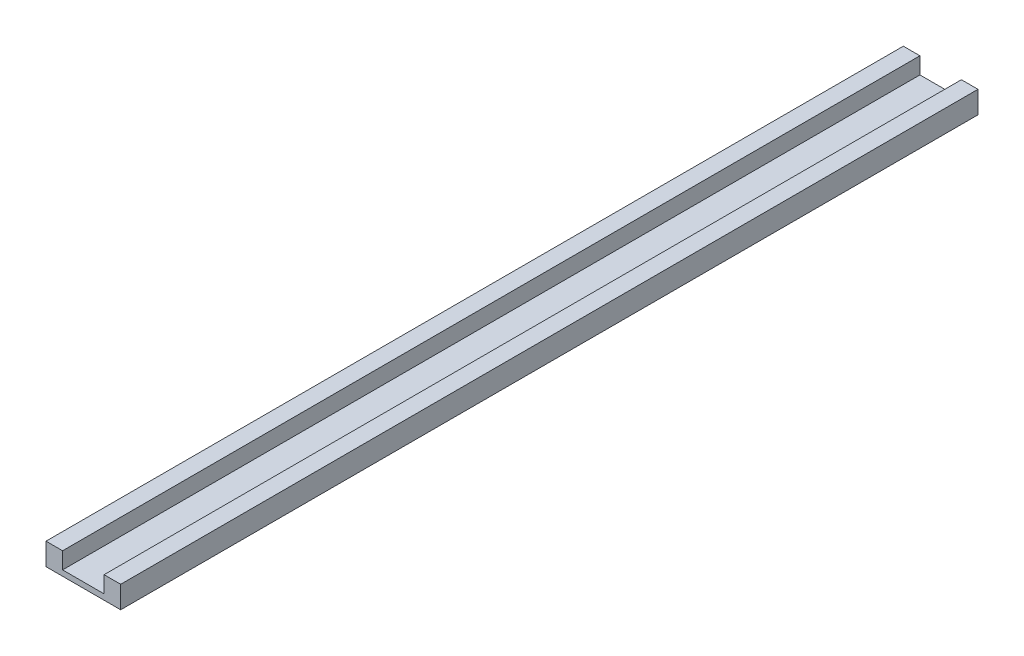
ISO-10303-21;
HEADER;
FILE_DESCRIPTION(('STEP AP214'),'2;1');
FILE_NAME('part.step','',(''),(''),'','','');
FILE_SCHEMA(('AUTOMOTIVE_DESIGN { 1 0 10303 214 1 1 1 1 }'));
ENDSEC;
DATA;
#1=APPLICATION_CONTEXT('core data for automotive mechanical design processes');
#2=APPLICATION_PROTOCOL_DEFINITION('international standard','automotive_design',2000,#1);
#3=PRODUCT_CONTEXT('',#1,'mechanical');
#4=PRODUCT('Part','Part','',(#3));
#5=PRODUCT_RELATED_PRODUCT_CATEGORY('part','',(#4));
#6=PRODUCT_DEFINITION_FORMATION('','',#4);
#7=PRODUCT_DEFINITION_CONTEXT('part definition',#1,'design');
#8=PRODUCT_DEFINITION('design','',#6,#7);
#9=PRODUCT_DEFINITION_SHAPE('','',#8);
#10=(LENGTH_UNIT() NAMED_UNIT(*) SI_UNIT(.MILLI.,.METRE.));
#11=(NAMED_UNIT(*) PLANE_ANGLE_UNIT() SI_UNIT($,.RADIAN.));
#12=(NAMED_UNIT(*) SI_UNIT($,.STERADIAN.) SOLID_ANGLE_UNIT());
#13=UNCERTAINTY_MEASURE_WITH_UNIT(LENGTH_MEASURE(1.E-05),#10,'distance_accuracy_value','');
#14=(GEOMETRIC_REPRESENTATION_CONTEXT(3) GLOBAL_UNCERTAINTY_ASSIGNED_CONTEXT((#13)) GLOBAL_UNIT_ASSIGNED_CONTEXT((#10,
#11,#12)) REPRESENTATION_CONTEXT('',''));
#15=CARTESIAN_POINT('',(0.,0.,0.));
#16=DIRECTION('',(0.,0.,1.));
#17=DIRECTION('',(1.,0.,0.));
#18=AXIS2_PLACEMENT_3D('',#15,#16,#17);
#19=CARTESIAN_POINT('',(0.,4.,350.));
#20=DIRECTION('',(0.,1.,0.));
#21=DIRECTION('',(0.,0.,1.));
#22=AXIS2_PLACEMENT_3D('',#19,#20,#21);
#23=PLANE('',#22);
#24=DIRECTION('',(0.,0.,-1.));
#25=VECTOR('',#24,1.);
#26=CARTESIAN_POINT('',(13.5,4.,350.));
#27=LINE('',#26,#25);
#28=CARTESIAN_POINT('',(13.5,4.,350.));
#29=VERTEX_POINT('',#28);
#30=CARTESIAN_POINT('',(13.5,4.,40.));
#31=VERTEX_POINT('',#30);
#32=EDGE_CURVE('E57',#29,#31,#27,.T.);
#33=ORIENTED_EDGE('',*,*,#32,.T.);
#34=DIRECTION('',(1.,0.,0.));
#35=VECTOR('',#34,1.);
#36=CARTESIAN_POINT('',(7.5,4.,40.));
#37=LINE('',#36,#35);
#38=CARTESIAN_POINT('',(7.5,4.,40.));
#39=VERTEX_POINT('',#38);
#40=EDGE_CURVE('E50',#39,#31,#37,.T.);
#41=ORIENTED_EDGE('',*,*,#40,.F.);
#42=DIRECTION('',(0.,0.,-1.));
#43=VECTOR('',#42,1.);
#44=CARTESIAN_POINT('',(7.5,4.,350.));
#45=LINE('',#44,#43);
#46=CARTESIAN_POINT('',(7.5,4.,350.));
#47=VERTEX_POINT('',#46);
#48=EDGE_CURVE('E11',#47,#39,#45,.T.);
#49=ORIENTED_EDGE('',*,*,#48,.F.);
#50=DIRECTION('',(1.,0.,0.));
#51=VECTOR('',#50,1.);
#52=CARTESIAN_POINT('',(0.,4.,350.));
#53=LINE('',#52,#51);
#54=EDGE_CURVE('E117',#47,#29,#53,.T.);
#55=ORIENTED_EDGE('',*,*,#54,.T.);
#56=EDGE_LOOP('',(#33,#41,#49,#55));
#57=FACE_BOUND('',#56,.T.);
#58=ADVANCED_FACE('F35',(#57),#23,.T.);
#59=CARTESIAN_POINT('',(7.5,0.,350.));
#60=DIRECTION('',(1.,0.,0.));
#61=DIRECTION('',(0.,0.,-1.));
#62=AXIS2_PLACEMENT_3D('',#59,#60,#61);
#63=PLANE('',#62);
#64=DIRECTION('',(0.,1.,0.));
#65=VECTOR('',#64,1.);
#66=CARTESIAN_POINT('',(7.5,-2.,40.));
#67=LINE('',#66,#65);
#68=CARTESIAN_POINT('',(7.5,-2.,40.));
#69=VERTEX_POINT('',#68);
#70=EDGE_CURVE('E99',#69,#39,#67,.T.);
#71=ORIENTED_EDGE('',*,*,#70,.F.);
#72=DIRECTION('',(0.,0.,-1.));
#73=VECTOR('',#72,1.);
#74=CARTESIAN_POINT('',(7.5,-2.,350.));
#75=LINE('',#74,#73);
#76=CARTESIAN_POINT('',(7.5,-2.,350.));
#77=VERTEX_POINT('',#76);
#78=EDGE_CURVE('E43',#77,#69,#75,.T.);
#79=ORIENTED_EDGE('',*,*,#78,.F.);
#80=DIRECTION('',(0.,-1.,0.));
#81=VECTOR('',#80,1.);
#82=CARTESIAN_POINT('',(7.5,0.,350.));
#83=LINE('',#82,#81);
#84=EDGE_CURVE('E111',#47,#77,#83,.T.);
#85=ORIENTED_EDGE('',*,*,#84,.F.);
#86=ORIENTED_EDGE('',*,*,#48,.T.);
#87=EDGE_LOOP('',(#71,#79,#85,#86));
#88=FACE_BOUND('',#87,.T.);
#89=ADVANCED_FACE('F37',(#88),#63,.F.);
#90=CARTESIAN_POINT('',(0.,-2.,350.));
#91=DIRECTION('',(0.,1.,0.));
#92=DIRECTION('',(0.,0.,1.));
#93=AXIS2_PLACEMENT_3D('',#90,#91,#92);
#94=PLANE('',#93);
#95=ORIENTED_EDGE('',*,*,#78,.T.);
#96=DIRECTION('',(1.,0.,0.));
#97=VECTOR('',#96,1.);
#98=CARTESIAN_POINT('',(-7.5,-2.,40.));
#99=LINE('',#98,#97);
#100=CARTESIAN_POINT('',(-7.5,-2.,40.));
#101=VERTEX_POINT('',#100);
#102=EDGE_CURVE('E102',#101,#69,#99,.T.);
#103=ORIENTED_EDGE('',*,*,#102,.F.);
#104=DIRECTION('',(0.,0.,-1.));
#105=VECTOR('',#104,1.);
#106=CARTESIAN_POINT('',(-7.5,-2.,350.));
#107=LINE('',#106,#105);
#108=CARTESIAN_POINT('',(-7.5,-2.,350.));
#109=VERTEX_POINT('',#108);
#110=EDGE_CURVE('E155',#109,#101,#107,.T.);
#111=ORIENTED_EDGE('',*,*,#110,.F.);
#112=DIRECTION('',(1.,0.,0.));
#113=VECTOR('',#112,1.);
#114=CARTESIAN_POINT('',(0.,-2.,350.));
#115=LINE('',#114,#113);
#116=EDGE_CURVE('E116',#109,#77,#115,.T.);
#117=ORIENTED_EDGE('',*,*,#116,.T.);
#118=EDGE_LOOP('',(#95,#103,#111,#117));
#119=FACE_BOUND('',#118,.T.);
#120=ADVANCED_FACE('F157',(#119),#94,.T.);
#121=CARTESIAN_POINT('',(-7.5,0.,350.));
#122=DIRECTION('',(1.,0.,0.));
#123=DIRECTION('',(0.,1.,0.));
#124=AXIS2_PLACEMENT_3D('',#121,#122,#123);
#125=PLANE('',#124);
#126=ORIENTED_EDGE('',*,*,#110,.T.);
#127=DIRECTION('',(0.,-1.,0.));
#128=VECTOR('',#127,1.);
#129=CARTESIAN_POINT('',(-7.5,4.,40.));
#130=LINE('',#129,#128);
#131=CARTESIAN_POINT('',(-7.5,4.,40.));
#132=VERTEX_POINT('',#131);
#133=EDGE_CURVE('E124',#132,#101,#130,.T.);
#134=ORIENTED_EDGE('',*,*,#133,.F.);
#135=DIRECTION('',(0.,0.,-1.));
#136=VECTOR('',#135,1.);
#137=CARTESIAN_POINT('',(-7.5,4.,350.));
#138=LINE('',#137,#136);
#139=CARTESIAN_POINT('',(-7.5,4.,350.));
#140=VERTEX_POINT('',#139);
#141=EDGE_CURVE('E153',#140,#132,#138,.T.);
#142=ORIENTED_EDGE('',*,*,#141,.F.);
#143=DIRECTION('',(0.,-1.,0.));
#144=VECTOR('',#143,1.);
#145=CARTESIAN_POINT('',(-7.5,0.,350.));
#146=LINE('',#145,#144);
#147=EDGE_CURVE('E128',#140,#109,#146,.T.);
#148=ORIENTED_EDGE('',*,*,#147,.T.);
#149=EDGE_LOOP('',(#126,#134,#142,#148));
#150=FACE_BOUND('',#149,.T.);
#151=ADVANCED_FACE('F190',(#150),#125,.T.);
#152=ORIENTED_EDGE('',*,*,#141,.T.);
#153=DIRECTION('',(1.,0.,0.));
#154=VECTOR('',#153,1.);
#155=CARTESIAN_POINT('',(-13.5,4.,40.));
#156=LINE('',#155,#154);
#157=CARTESIAN_POINT('',(-13.5,4.,40.));
#158=VERTEX_POINT('',#157);
#159=EDGE_CURVE('E196',#158,#132,#156,.T.);
#160=ORIENTED_EDGE('',*,*,#159,.F.);
#161=DIRECTION('',(0.,0.,-1.));
#162=VECTOR('',#161,1.);
#163=CARTESIAN_POINT('',(-13.5,4.,350.));
#164=LINE('',#163,#162);
#165=CARTESIAN_POINT('',(-13.5,4.,350.));
#166=VERTEX_POINT('',#165);
#167=EDGE_CURVE('E150',#166,#158,#164,.T.);
#168=ORIENTED_EDGE('',*,*,#167,.F.);
#169=EDGE_CURVE('E123',#166,#140,#53,.T.);
#170=ORIENTED_EDGE('',*,*,#169,.T.);
#171=EDGE_LOOP('',(#152,#160,#168,#170));
#172=FACE_BOUND('',#171,.T.);
#173=ADVANCED_FACE('F182',(#172),#23,.T.);
#174=CARTESIAN_POINT('',(-13.5,0.,350.));
#175=DIRECTION('',(1.,0.,0.));
#176=DIRECTION('',(0.,1.,0.));
#177=AXIS2_PLACEMENT_3D('',#174,#175,#176);
#178=PLANE('',#177);
#179=DIRECTION('',(0.,1.,0.));
#180=VECTOR('',#179,1.);
#181=CARTESIAN_POINT('',(-13.5,-4.,40.));
#182=LINE('',#181,#180);
#183=CARTESIAN_POINT('',(-13.5,-4.,40.));
#184=VERTEX_POINT('',#183);
#185=EDGE_CURVE('E165',#184,#158,#182,.T.);
#186=ORIENTED_EDGE('',*,*,#185,.F.);
#187=DIRECTION('',(0.,0.,-1.));
#188=VECTOR('',#187,1.);
#189=CARTESIAN_POINT('',(-13.5,-4.,350.));
#190=LINE('',#189,#188);
#191=CARTESIAN_POINT('',(-13.5,-4.,350.));
#192=VERTEX_POINT('',#191);
#193=EDGE_CURVE('E147',#192,#184,#190,.T.);
#194=ORIENTED_EDGE('',*,*,#193,.F.);
#195=DIRECTION('',(0.,-1.,0.));
#196=VECTOR('',#195,1.);
#197=CARTESIAN_POINT('',(-13.5,0.,350.));
#198=LINE('',#197,#196);
#199=EDGE_CURVE('E127',#166,#192,#198,.T.);
#200=ORIENTED_EDGE('',*,*,#199,.F.);
#201=ORIENTED_EDGE('',*,*,#167,.T.);
#202=EDGE_LOOP('',(#186,#194,#200,#201));
#203=FACE_BOUND('',#202,.T.);
#204=ADVANCED_FACE('F164',(#203),#178,.F.);
#205=CARTESIAN_POINT('',(0.,-4.,350.));
#206=DIRECTION('',(0.,1.,0.));
#207=DIRECTION('',(0.,0.,1.));
#208=AXIS2_PLACEMENT_3D('',#205,#206,#207);
#209=PLANE('',#208);
#210=DIRECTION('',(-1.,0.,0.));
#211=VECTOR('',#210,1.);
#212=CARTESIAN_POINT('',(13.5,-4.,40.));
#213=LINE('',#212,#211);
#214=CARTESIAN_POINT('',(13.5,-4.,40.));
#215=VERTEX_POINT('',#214);
#216=EDGE_CURVE('E169',#215,#184,#213,.T.);
#217=ORIENTED_EDGE('',*,*,#216,.F.);
#218=DIRECTION('',(0.,0.,-1.));
#219=VECTOR('',#218,1.);
#220=CARTESIAN_POINT('',(13.5,-4.,350.));
#221=LINE('',#220,#219);
#222=CARTESIAN_POINT('',(13.5,-4.,350.));
#223=VERTEX_POINT('',#222);
#224=EDGE_CURVE('E144',#223,#215,#221,.T.);
#225=ORIENTED_EDGE('',*,*,#224,.F.);
#226=DIRECTION('',(1.,0.,0.));
#227=VECTOR('',#226,1.);
#228=CARTESIAN_POINT('',(0.,-4.,350.));
#229=LINE('',#228,#227);
#230=EDGE_CURVE('E132',#192,#223,#229,.T.);
#231=ORIENTED_EDGE('',*,*,#230,.F.);
#232=ORIENTED_EDGE('',*,*,#193,.T.);
#233=EDGE_LOOP('',(#217,#225,#231,#232));
#234=FACE_BOUND('',#233,.T.);
#235=ADVANCED_FACE('F168',(#234),#209,.F.);
#236=CARTESIAN_POINT('',(13.5,0.,350.));
#237=DIRECTION('',(1.,0.,0.));
#238=DIRECTION('',(0.,1.,0.));
#239=AXIS2_PLACEMENT_3D('',#236,#237,#238);
#240=PLANE('',#239);
#241=ORIENTED_EDGE('',*,*,#224,.T.);
#242=DIRECTION('',(0.,-1.,0.));
#243=VECTOR('',#242,1.);
#244=CARTESIAN_POINT('',(13.5,4.,40.));
#245=LINE('',#244,#243);
#246=EDGE_CURVE('E109',#31,#215,#245,.T.);
#247=ORIENTED_EDGE('',*,*,#246,.F.);
#248=ORIENTED_EDGE('',*,*,#32,.F.);
#249=DIRECTION('',(0.,-1.,0.));
#250=VECTOR('',#249,1.);
#251=CARTESIAN_POINT('',(13.5,0.,350.));
#252=LINE('',#251,#250);
#253=EDGE_CURVE('E121',#29,#223,#252,.T.);
#254=ORIENTED_EDGE('',*,*,#253,.T.);
#255=EDGE_LOOP('',(#241,#247,#248,#254));
#256=FACE_BOUND('',#255,.T.);
#257=ADVANCED_FACE('F170',(#256),#240,.T.);
#258=CARTESIAN_POINT('',(0.,0.,350.));
#259=DIRECTION('',(0.,0.,1.));
#260=DIRECTION('',(1.,0.,0.));
#261=AXIS2_PLACEMENT_3D('',#258,#259,#260);
#262=PLANE('',#261);
#263=ORIENTED_EDGE('',*,*,#54,.F.);
#264=ORIENTED_EDGE('',*,*,#84,.T.);
#265=ORIENTED_EDGE('',*,*,#116,.F.);
#266=ORIENTED_EDGE('',*,*,#147,.F.);
#267=ORIENTED_EDGE('',*,*,#169,.F.);
#268=ORIENTED_EDGE('',*,*,#199,.T.);
#269=ORIENTED_EDGE('',*,*,#230,.T.);
#270=ORIENTED_EDGE('',*,*,#253,.F.);
#271=EDGE_LOOP('',(#263,#264,#265,#266,#267,#268,#269,#270));
#272=FACE_BOUND('',#271,.T.);
#273=ADVANCED_FACE('F120',(#272),#262,.T.);
#274=CARTESIAN_POINT('',(0.,0.,40.));
#275=DIRECTION('',(0.,0.,-1.));
#276=DIRECTION('',(-1.,0.,0.));
#277=AXIS2_PLACEMENT_3D('',#274,#275,#276);
#278=PLANE('',#277);
#279=ORIENTED_EDGE('',*,*,#70,.T.);
#280=ORIENTED_EDGE('',*,*,#40,.T.);
#281=ORIENTED_EDGE('',*,*,#246,.T.);
#282=ORIENTED_EDGE('',*,*,#216,.T.);
#283=ORIENTED_EDGE('',*,*,#185,.T.);
#284=ORIENTED_EDGE('',*,*,#159,.T.);
#285=ORIENTED_EDGE('',*,*,#133,.T.);
#286=ORIENTED_EDGE('',*,*,#102,.T.);
#287=EDGE_LOOP('',(#279,#280,#281,#282,#283,#284,#285,#286));
#288=FACE_BOUND('',#287,.T.);
#289=ADVANCED_FACE('F100',(#288),#278,.T.);
#290=CLOSED_SHELL('',(#58,#89,#120,#151,#173,#204,#235,#257,#273,#289));
#291=MANIFOLD_SOLID_BREP('B2',#290);
#292=ADVANCED_BREP_SHAPE_REPRESENTATION('',(#18,#291),#14);
#293=SHAPE_DEFINITION_REPRESENTATION(#9,#292);
ENDSEC;
END-ISO-10303-21;
